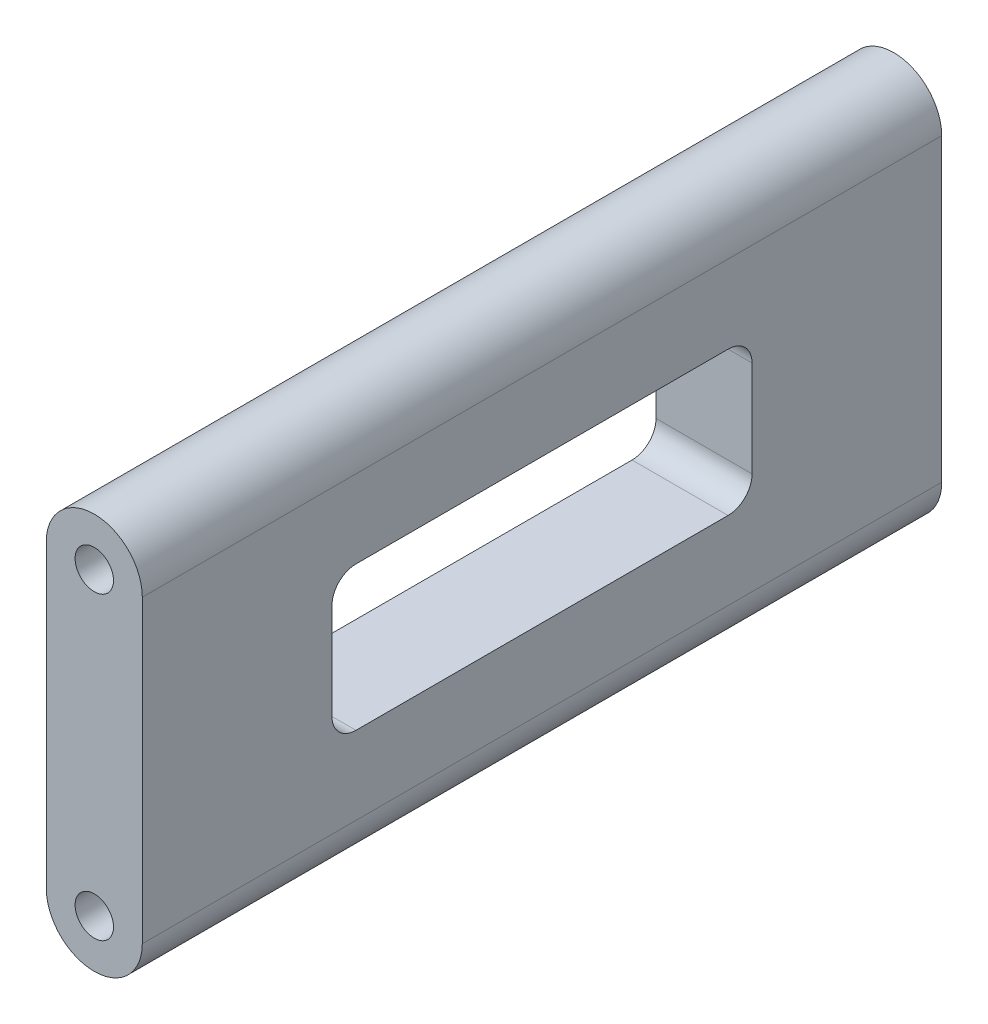
ISO-10303-21;
HEADER;
FILE_DESCRIPTION(('STEP AP214'),'2;1');
FILE_NAME('part.step','',(''),(''),'','','');
FILE_SCHEMA(('AUTOMOTIVE_DESIGN { 1 0 10303 214 1 1 1 1 }'));
ENDSEC;
DATA;
#1=APPLICATION_CONTEXT('core data for automotive mechanical design processes');
#2=APPLICATION_PROTOCOL_DEFINITION('international standard','automotive_design',2000,#1);
#3=PRODUCT_CONTEXT('',#1,'mechanical');
#4=PRODUCT('Part','Part','',(#3));
#5=PRODUCT_RELATED_PRODUCT_CATEGORY('part','',(#4));
#6=PRODUCT_DEFINITION_FORMATION('','',#4);
#7=PRODUCT_DEFINITION_CONTEXT('part definition',#1,'design');
#8=PRODUCT_DEFINITION('design','',#6,#7);
#9=PRODUCT_DEFINITION_SHAPE('','',#8);
#10=(LENGTH_UNIT() NAMED_UNIT(*) SI_UNIT(.MILLI.,.METRE.));
#11=(NAMED_UNIT(*) PLANE_ANGLE_UNIT() SI_UNIT($,.RADIAN.));
#12=(NAMED_UNIT(*) SI_UNIT($,.STERADIAN.) SOLID_ANGLE_UNIT());
#13=UNCERTAINTY_MEASURE_WITH_UNIT(LENGTH_MEASURE(1.E-05),#10,'distance_accuracy_value','');
#14=(GEOMETRIC_REPRESENTATION_CONTEXT(3) GLOBAL_UNCERTAINTY_ASSIGNED_CONTEXT((#13)) GLOBAL_UNIT_ASSIGNED_CONTEXT((#10,
#11,#12)) REPRESENTATION_CONTEXT('',''));
#15=CARTESIAN_POINT('',(0.,0.,0.));
#16=DIRECTION('',(0.,0.,1.));
#17=DIRECTION('',(1.,0.,0.));
#18=AXIS2_PLACEMENT_3D('',#15,#16,#17);
#19=CARTESIAN_POINT('',(0.,-12.5,66.6));
#20=DIRECTION('',(0.,0.,1.));
#21=DIRECTION('',(1.,0.,0.));
#22=AXIS2_PLACEMENT_3D('',#19,#20,#21);
#23=PLANE('',#22);
#24=CARTESIAN_POINT('',(0.,12.5,66.6));
#25=DIRECTION('',(0.,0.,1.));
#26=DIRECTION('',(1.,0.,0.));
#27=AXIS2_PLACEMENT_3D('',#24,#25,#26);
#28=CIRCLE('',#27,1.6);
#29=CARTESIAN_POINT('',(1.6,12.5,66.6));
#30=VERTEX_POINT('',#29);
#31=EDGE_CURVE('E201',#30,#30,#28,.T.);
#32=ORIENTED_EDGE('',*,*,#31,.F.);
#33=EDGE_LOOP('',(#32));
#34=FACE_BOUND('',#33,.T.);
#35=CARTESIAN_POINT('',(0.,-12.5,66.6));
#36=DIRECTION('',(0.,0.,1.));
#37=DIRECTION('',(1.,0.,0.));
#38=AXIS2_PLACEMENT_3D('',#35,#36,#37);
#39=CIRCLE('',#38,4.);
#40=CARTESIAN_POINT('',(-4.,-12.5,66.6));
#41=VERTEX_POINT('',#40);
#42=CARTESIAN_POINT('',(4.,-12.5,66.6));
#43=VERTEX_POINT('',#42);
#44=EDGE_CURVE('E207',#41,#43,#39,.T.);
#45=ORIENTED_EDGE('',*,*,#44,.T.);
#46=DIRECTION('',(0.,1.,0.));
#47=VECTOR('',#46,1.);
#48=CARTESIAN_POINT('',(4.,-12.5,66.6));
#49=LINE('',#48,#47);
#50=CARTESIAN_POINT('',(4.,12.5,66.6));
#51=VERTEX_POINT('',#50);
#52=EDGE_CURVE('E210',#43,#51,#49,.T.);
#53=ORIENTED_EDGE('',*,*,#52,.T.);
#54=CARTESIAN_POINT('',(0.,12.5,66.6));
#55=DIRECTION('',(0.,0.,1.));
#56=DIRECTION('',(1.,0.,0.));
#57=AXIS2_PLACEMENT_3D('',#54,#55,#56);
#58=CIRCLE('',#57,4.);
#59=CARTESIAN_POINT('',(-4.,12.5,66.6));
#60=VERTEX_POINT('',#59);
#61=EDGE_CURVE('E213',#51,#60,#58,.T.);
#62=ORIENTED_EDGE('',*,*,#61,.T.);
#63=DIRECTION('',(0.,-1.,0.));
#64=VECTOR('',#63,1.);
#65=CARTESIAN_POINT('',(-4.,-12.5,66.6));
#66=LINE('',#65,#64);
#67=EDGE_CURVE('E215',#60,#41,#66,.T.);
#68=ORIENTED_EDGE('',*,*,#67,.T.);
#69=EDGE_LOOP('',(#45,#53,#62,#68));
#70=FACE_BOUND('',#69,.T.);
#71=CARTESIAN_POINT('',(0.,-12.5,66.6));
#72=DIRECTION('',(0.,0.,1.));
#73=DIRECTION('',(1.,0.,0.));
#74=AXIS2_PLACEMENT_3D('',#71,#72,#73);
#75=CIRCLE('',#74,1.6);
#76=CARTESIAN_POINT('',(1.6,-12.5,66.6));
#77=VERTEX_POINT('',#76);
#78=EDGE_CURVE('E195',#77,#77,#75,.T.);
#79=ORIENTED_EDGE('',*,*,#78,.F.);
#80=EDGE_LOOP('',(#79));
#81=FACE_BOUND('',#80,.T.);
#82=ADVANCED_FACE('F37',(#34,#70,#81),#23,.T.);
#83=CARTESIAN_POINT('',(0.,-12.5,0.));
#84=DIRECTION('',(0.,0.,1.));
#85=DIRECTION('',(1.,0.,0.));
#86=AXIS2_PLACEMENT_3D('',#83,#84,#85);
#87=PLANE('',#86);
#88=CARTESIAN_POINT('',(0.,-12.5,0.));
#89=DIRECTION('',(0.,0.,1.));
#90=DIRECTION('',(1.,0.,0.));
#91=AXIS2_PLACEMENT_3D('',#88,#89,#90);
#92=CIRCLE('',#91,4.);
#93=CARTESIAN_POINT('',(-4.,-12.5,0.));
#94=VERTEX_POINT('',#93);
#95=CARTESIAN_POINT('',(4.,-12.5,0.));
#96=VERTEX_POINT('',#95);
#97=EDGE_CURVE('E204',#94,#96,#92,.T.);
#98=ORIENTED_EDGE('',*,*,#97,.F.);
#99=DIRECTION('',(0.,-1.,0.));
#100=VECTOR('',#99,1.);
#101=CARTESIAN_POINT('',(-4.,-12.5,0.));
#102=LINE('',#101,#100);
#103=CARTESIAN_POINT('',(-4.,12.5,0.));
#104=VERTEX_POINT('',#103);
#105=EDGE_CURVE('E211',#104,#94,#102,.T.);
#106=ORIENTED_EDGE('',*,*,#105,.F.);
#107=CARTESIAN_POINT('',(0.,12.5,0.));
#108=DIRECTION('',(0.,0.,1.));
#109=DIRECTION('',(1.,0.,0.));
#110=AXIS2_PLACEMENT_3D('',#107,#108,#109);
#111=CIRCLE('',#110,4.);
#112=CARTESIAN_POINT('',(4.,12.5,0.));
#113=VERTEX_POINT('',#112);
#114=EDGE_CURVE('E222',#113,#104,#111,.T.);
#115=ORIENTED_EDGE('',*,*,#114,.F.);
#116=DIRECTION('',(0.,1.,0.));
#117=VECTOR('',#116,1.);
#118=CARTESIAN_POINT('',(4.,-12.5,0.));
#119=LINE('',#118,#117);
#120=EDGE_CURVE('E220',#96,#113,#119,.T.);
#121=ORIENTED_EDGE('',*,*,#120,.F.);
#122=EDGE_LOOP('',(#98,#106,#115,#121));
#123=FACE_BOUND('',#122,.T.);
#124=CARTESIAN_POINT('',(0.,12.5,0.));
#125=DIRECTION('',(0.,0.,1.));
#126=DIRECTION('',(1.,0.,0.));
#127=AXIS2_PLACEMENT_3D('',#124,#125,#126);
#128=CIRCLE('',#127,1.6);
#129=CARTESIAN_POINT('',(1.6,12.5,0.));
#130=VERTEX_POINT('',#129);
#131=EDGE_CURVE('E198',#130,#130,#128,.T.);
#132=ORIENTED_EDGE('',*,*,#131,.T.);
#133=EDGE_LOOP('',(#132));
#134=FACE_BOUND('',#133,.T.);
#135=CARTESIAN_POINT('',(0.,-12.5,0.));
#136=DIRECTION('',(0.,0.,1.));
#137=DIRECTION('',(1.,0.,0.));
#138=AXIS2_PLACEMENT_3D('',#135,#136,#137);
#139=CIRCLE('',#138,1.6);
#140=CARTESIAN_POINT('',(1.6,-12.5,0.));
#141=VERTEX_POINT('',#140);
#142=EDGE_CURVE('E183',#141,#141,#139,.T.);
#143=ORIENTED_EDGE('',*,*,#142,.T.);
#144=EDGE_LOOP('',(#143));
#145=FACE_BOUND('',#144,.T.);
#146=ADVANCED_FACE('F240',(#123,#134,#145),#87,.F.);
#147=CARTESIAN_POINT('',(0.,-12.5,66.6));
#148=DIRECTION('',(0.,0.,-1.));
#149=DIRECTION('',(-1.,0.,0.));
#150=AXIS2_PLACEMENT_3D('',#147,#148,#149);
#151=CYLINDRICAL_SURFACE('',#150,4.);
#152=ORIENTED_EDGE('',*,*,#97,.T.);
#153=DIRECTION('',(0.,0.,-1.));
#154=VECTOR('',#153,1.);
#155=CARTESIAN_POINT('',(4.,-12.5,66.6));
#156=LINE('',#155,#154);
#157=EDGE_CURVE('E11',#43,#96,#156,.T.);
#158=ORIENTED_EDGE('',*,*,#157,.F.);
#159=ORIENTED_EDGE('',*,*,#44,.F.);
#160=DIRECTION('',(0.,0.,-1.));
#161=VECTOR('',#160,1.);
#162=CARTESIAN_POINT('',(-4.,-12.5,66.6));
#163=LINE('',#162,#161);
#164=EDGE_CURVE('E217',#41,#94,#163,.T.);
#165=ORIENTED_EDGE('',*,*,#164,.T.);
#166=EDGE_LOOP('',(#152,#158,#159,#165));
#167=FACE_BOUND('',#166,.T.);
#168=ADVANCED_FACE('F39',(#167),#151,.T.);
#169=CARTESIAN_POINT('',(4.,-12.5,66.6));
#170=DIRECTION('',(-1.,0.,0.));
#171=DIRECTION('',(0.,-1.,0.));
#172=AXIS2_PLACEMENT_3D('',#169,#170,#171);
#173=PLANE('',#172);
#174=DIRECTION('',(0.,0.,-1.));
#175=VECTOR('',#174,1.);
#176=CARTESIAN_POINT('',(4.,-6.,17.8));
#177=LINE('',#176,#175);
#178=CARTESIAN_POINT('',(4.,-6.00000000000001,48.8));
#179=VERTEX_POINT('',#178);
#180=CARTESIAN_POINT('',(4.,-6.,17.8));
#181=VERTEX_POINT('',#180);
#182=EDGE_CURVE('E165',#179,#181,#177,.T.);
#183=ORIENTED_EDGE('',*,*,#182,.F.);
#184=CARTESIAN_POINT('',(4.,-4.00000000000001,48.8));
#185=DIRECTION('',(1.,0.,0.));
#186=DIRECTION('',(0.,-1.,0.));
#187=AXIS2_PLACEMENT_3D('',#184,#185,#186);
#188=CIRCLE('',#187,2.);
#189=CARTESIAN_POINT('',(4.,-3.99999999999999,50.8));
#190=VERTEX_POINT('',#189);
#191=EDGE_CURVE('E52',#190,#179,#188,.T.);
#192=ORIENTED_EDGE('',*,*,#191,.F.);
#193=DIRECTION('',(0.,-1.,0.));
#194=VECTOR('',#193,1.);
#195=CARTESIAN_POINT('',(4.,-3.99999999999999,50.8));
#196=LINE('',#195,#194);
#197=CARTESIAN_POINT('',(4.,3.99999999999998,50.8));
#198=VERTEX_POINT('',#197);
#199=EDGE_CURVE('E145',#198,#190,#196,.T.);
#200=ORIENTED_EDGE('',*,*,#199,.F.);
#201=CARTESIAN_POINT('',(4.,3.99999999999999,48.8));
#202=DIRECTION('',(1.,0.,0.));
#203=DIRECTION('',(0.,1.,0.));
#204=AXIS2_PLACEMENT_3D('',#201,#202,#203);
#205=CIRCLE('',#204,2.);
#206=CARTESIAN_POINT('',(4.,5.99999999999999,48.8));
#207=VERTEX_POINT('',#206);
#208=EDGE_CURVE('E148',#207,#198,#205,.T.);
#209=ORIENTED_EDGE('',*,*,#208,.F.);
#210=DIRECTION('',(0.,0.,1.));
#211=VECTOR('',#210,1.);
#212=CARTESIAN_POINT('',(4.,6.,17.8));
#213=LINE('',#212,#211);
#214=CARTESIAN_POINT('',(4.,6.,17.8));
#215=VERTEX_POINT('',#214);
#216=EDGE_CURVE('E176',#215,#207,#213,.T.);
#217=ORIENTED_EDGE('',*,*,#216,.F.);
#218=CARTESIAN_POINT('',(4.,4.,17.8));
#219=DIRECTION('',(1.,0.,0.));
#220=DIRECTION('',(0.,1.,0.));
#221=AXIS2_PLACEMENT_3D('',#218,#219,#220);
#222=CIRCLE('',#221,2.);
#223=CARTESIAN_POINT('',(4.,3.99999999999999,15.8));
#224=VERTEX_POINT('',#223);
#225=EDGE_CURVE('E173',#224,#215,#222,.T.);
#226=ORIENTED_EDGE('',*,*,#225,.F.);
#227=DIRECTION('',(0.,1.,0.));
#228=VECTOR('',#227,1.);
#229=CARTESIAN_POINT('',(4.,-3.99999999999999,15.8));
#230=LINE('',#229,#228);
#231=CARTESIAN_POINT('',(4.,-3.99999999999999,15.8));
#232=VERTEX_POINT('',#231);
#233=EDGE_CURVE('E170',#232,#224,#230,.T.);
#234=ORIENTED_EDGE('',*,*,#233,.F.);
#235=CARTESIAN_POINT('',(4.,-4.,17.8));
#236=DIRECTION('',(1.,0.,0.));
#237=DIRECTION('',(0.,1.,0.));
#238=AXIS2_PLACEMENT_3D('',#235,#236,#237);
#239=CIRCLE('',#238,2.);
#240=EDGE_CURVE('E167',#181,#232,#239,.T.);
#241=ORIENTED_EDGE('',*,*,#240,.F.);
#242=EDGE_LOOP('',(#183,#192,#200,#209,#217,#226,#234,#241));
#243=FACE_BOUND('',#242,.T.);
#244=ORIENTED_EDGE('',*,*,#120,.T.);
#245=DIRECTION('',(0.,0.,-1.));
#246=VECTOR('',#245,1.);
#247=CARTESIAN_POINT('',(4.,12.5,66.6));
#248=LINE('',#247,#246);
#249=EDGE_CURVE('E45',#51,#113,#248,.T.);
#250=ORIENTED_EDGE('',*,*,#249,.F.);
#251=ORIENTED_EDGE('',*,*,#52,.F.);
#252=ORIENTED_EDGE('',*,*,#157,.T.);
#253=EDGE_LOOP('',(#244,#250,#251,#252));
#254=FACE_BOUND('',#253,.T.);
#255=ADVANCED_FACE('F249',(#243,#254),#173,.F.);
#256=CARTESIAN_POINT('',(0.,12.5,66.6));
#257=DIRECTION('',(0.,0.,-1.));
#258=DIRECTION('',(-1.,0.,0.));
#259=AXIS2_PLACEMENT_3D('',#256,#257,#258);
#260=CYLINDRICAL_SURFACE('',#259,4.);
#261=ORIENTED_EDGE('',*,*,#114,.T.);
#262=DIRECTION('',(0.,0.,-1.));
#263=VECTOR('',#262,1.);
#264=CARTESIAN_POINT('',(-4.,12.5,66.6));
#265=LINE('',#264,#263);
#266=EDGE_CURVE('E227',#60,#104,#265,.T.);
#267=ORIENTED_EDGE('',*,*,#266,.F.);
#268=ORIENTED_EDGE('',*,*,#61,.F.);
#269=ORIENTED_EDGE('',*,*,#249,.T.);
#270=EDGE_LOOP('',(#261,#267,#268,#269));
#271=FACE_BOUND('',#270,.T.);
#272=ADVANCED_FACE('F234',(#271),#260,.T.);
#273=CARTESIAN_POINT('',(-4.,-12.5,66.6));
#274=DIRECTION('',(1.,0.,0.));
#275=DIRECTION('',(0.,1.,0.));
#276=AXIS2_PLACEMENT_3D('',#273,#274,#275);
#277=PLANE('',#276);
#278=DIRECTION('',(0.,-1.,0.));
#279=VECTOR('',#278,1.);
#280=CARTESIAN_POINT('',(-4.00000000000001,-3.99999999999999,50.8));
#281=LINE('',#280,#279);
#282=CARTESIAN_POINT('',(-4.00000000000001,3.99999999999998,50.8));
#283=VERTEX_POINT('',#282);
#284=CARTESIAN_POINT('',(-4.00000000000001,-3.99999999999999,50.8));
#285=VERTEX_POINT('',#284);
#286=EDGE_CURVE('E134',#283,#285,#281,.T.);
#287=ORIENTED_EDGE('',*,*,#286,.T.);
#288=CARTESIAN_POINT('',(-4.00000000000001,-4.00000000000001,48.8));
#289=DIRECTION('',(1.,0.,0.));
#290=DIRECTION('',(0.,-1.,0.));
#291=AXIS2_PLACEMENT_3D('',#288,#289,#290);
#292=CIRCLE('',#291,2.);
#293=CARTESIAN_POINT('',(-4.00000000000001,-6.00000000000001,48.8));
#294=VERTEX_POINT('',#293);
#295=EDGE_CURVE('E128',#285,#294,#292,.T.);
#296=ORIENTED_EDGE('',*,*,#295,.T.);
#297=DIRECTION('',(0.,0.,-1.));
#298=VECTOR('',#297,1.);
#299=CARTESIAN_POINT('',(-4.00000000000001,-6.,17.8));
#300=LINE('',#299,#298);
#301=CARTESIAN_POINT('',(-4.,-6.,17.8));
#302=VERTEX_POINT('',#301);
#303=EDGE_CURVE('E137',#294,#302,#300,.T.);
#304=ORIENTED_EDGE('',*,*,#303,.T.);
#305=CARTESIAN_POINT('',(-4.00000000000001,-4.,17.8));
#306=DIRECTION('',(1.,0.,0.));
#307=DIRECTION('',(0.,1.,0.));
#308=AXIS2_PLACEMENT_3D('',#305,#306,#307);
#309=CIRCLE('',#308,2.);
#310=CARTESIAN_POINT('',(-4.00000000000001,-3.99999999999999,15.8));
#311=VERTEX_POINT('',#310);
#312=EDGE_CURVE('E60',#302,#311,#309,.T.);
#313=ORIENTED_EDGE('',*,*,#312,.T.);
#314=DIRECTION('',(0.,1.,0.));
#315=VECTOR('',#314,1.);
#316=CARTESIAN_POINT('',(-4.00000000000001,-3.99999999999999,15.8));
#317=LINE('',#316,#315);
#318=CARTESIAN_POINT('',(-4.00000000000001,3.99999999999998,15.8));
#319=VERTEX_POINT('',#318);
#320=EDGE_CURVE('E152',#311,#319,#317,.T.);
#321=ORIENTED_EDGE('',*,*,#320,.T.);
#322=CARTESIAN_POINT('',(-4.00000000000001,4.,17.8));
#323=DIRECTION('',(1.,0.,0.));
#324=DIRECTION('',(0.,1.,0.));
#325=AXIS2_PLACEMENT_3D('',#322,#323,#324);
#326=CIRCLE('',#325,2.);
#327=CARTESIAN_POINT('',(-4.00000000000001,6.,17.8));
#328=VERTEX_POINT('',#327);
#329=EDGE_CURVE('E155',#319,#328,#326,.T.);
#330=ORIENTED_EDGE('',*,*,#329,.T.);
#331=DIRECTION('',(0.,0.,1.));
#332=VECTOR('',#331,1.);
#333=CARTESIAN_POINT('',(-4.00000000000001,6.,17.8));
#334=LINE('',#333,#332);
#335=CARTESIAN_POINT('',(-4.00000000000001,5.99999999999999,48.8));
#336=VERTEX_POINT('',#335);
#337=EDGE_CURVE('E158',#328,#336,#334,.T.);
#338=ORIENTED_EDGE('',*,*,#337,.T.);
#339=CARTESIAN_POINT('',(-4.00000000000001,3.99999999999999,48.8));
#340=DIRECTION('',(1.,0.,0.));
#341=DIRECTION('',(0.,1.,0.));
#342=AXIS2_PLACEMENT_3D('',#339,#340,#341);
#343=CIRCLE('',#342,2.);
#344=EDGE_CURVE('E161',#336,#283,#343,.T.);
#345=ORIENTED_EDGE('',*,*,#344,.T.);
#346=EDGE_LOOP('',(#287,#296,#304,#313,#321,#330,#338,#345));
#347=FACE_BOUND('',#346,.T.);
#348=ORIENTED_EDGE('',*,*,#105,.T.);
#349=ORIENTED_EDGE('',*,*,#164,.F.);
#350=ORIENTED_EDGE('',*,*,#67,.F.);
#351=ORIENTED_EDGE('',*,*,#266,.T.);
#352=EDGE_LOOP('',(#348,#349,#350,#351));
#353=FACE_BOUND('',#352,.T.);
#354=ADVANCED_FACE('F141',(#347,#353),#277,.F.);
#355=CARTESIAN_POINT('',(0.,12.5,66.6));
#356=DIRECTION('',(0.,0.,-1.));
#357=DIRECTION('',(-1.,0.,0.));
#358=AXIS2_PLACEMENT_3D('',#355,#356,#357);
#359=CYLINDRICAL_SURFACE('',#358,1.6);
#360=ORIENTED_EDGE('',*,*,#31,.T.);
#361=EDGE_LOOP('',(#360));
#362=FACE_BOUND('',#361,.T.);
#363=ORIENTED_EDGE('',*,*,#131,.F.);
#364=EDGE_LOOP('',(#363));
#365=FACE_BOUND('',#364,.T.);
#366=ADVANCED_FACE('F268',(#362,#365),#359,.F.);
#367=CARTESIAN_POINT('',(0.,-12.5,66.6));
#368=DIRECTION('',(0.,0.,-1.));
#369=DIRECTION('',(-1.,0.,0.));
#370=AXIS2_PLACEMENT_3D('',#367,#368,#369);
#371=CYLINDRICAL_SURFACE('',#370,1.6);
#372=ORIENTED_EDGE('',*,*,#78,.T.);
#373=EDGE_LOOP('',(#372));
#374=FACE_BOUND('',#373,.T.);
#375=ORIENTED_EDGE('',*,*,#142,.F.);
#376=EDGE_LOOP('',(#375));
#377=FACE_BOUND('',#376,.T.);
#378=ADVANCED_FACE('F275',(#374,#377),#371,.F.);
#379=CARTESIAN_POINT('',(-4.00000000000001,-4.00000000000001,48.8));
#380=DIRECTION('',(1.,0.,0.));
#381=DIRECTION('',(0.,1.,0.));
#382=AXIS2_PLACEMENT_3D('',#379,#380,#381);
#383=CYLINDRICAL_SURFACE('',#382,2.);
#384=ORIENTED_EDGE('',*,*,#191,.T.);
#385=DIRECTION('',(1.,0.,0.));
#386=VECTOR('',#385,1.);
#387=CARTESIAN_POINT('',(-4.00000000000001,-6.00000000000001,48.8));
#388=LINE('',#387,#386);
#389=EDGE_CURVE('E124',#294,#179,#388,.T.);
#390=ORIENTED_EDGE('',*,*,#389,.F.);
#391=ORIENTED_EDGE('',*,*,#295,.F.);
#392=DIRECTION('',(1.,0.,0.));
#393=VECTOR('',#392,1.);
#394=CARTESIAN_POINT('',(-4.00000000000001,-3.99999999999999,50.8));
#395=LINE('',#394,#393);
#396=EDGE_CURVE('E181',#285,#190,#395,.T.);
#397=ORIENTED_EDGE('',*,*,#396,.T.);
#398=EDGE_LOOP('',(#384,#390,#391,#397));
#399=FACE_BOUND('',#398,.T.);
#400=ADVANCED_FACE('F126',(#399),#383,.F.);
#401=CARTESIAN_POINT('',(-4.00000000000001,-3.99999999999999,50.8));
#402=DIRECTION('',(0.,0.,1.));
#403=DIRECTION('',(1.,0.,0.));
#404=AXIS2_PLACEMENT_3D('',#401,#402,#403);
#405=PLANE('',#404);
#406=ORIENTED_EDGE('',*,*,#199,.T.);
#407=ORIENTED_EDGE('',*,*,#396,.F.);
#408=ORIENTED_EDGE('',*,*,#286,.F.);
#409=DIRECTION('',(1.,0.,0.));
#410=VECTOR('',#409,1.);
#411=CARTESIAN_POINT('',(-4.00000000000001,3.99999999999998,50.8));
#412=LINE('',#411,#410);
#413=EDGE_CURVE('E184',#283,#198,#412,.T.);
#414=ORIENTED_EDGE('',*,*,#413,.T.);
#415=EDGE_LOOP('',(#406,#407,#408,#414));
#416=FACE_BOUND('',#415,.T.);
#417=ADVANCED_FACE('F287',(#416),#405,.F.);
#418=CARTESIAN_POINT('',(-4.00000000000001,3.99999999999999,48.8));
#419=DIRECTION('',(1.,0.,0.));
#420=DIRECTION('',(0.,1.,0.));
#421=AXIS2_PLACEMENT_3D('',#418,#419,#420);
#422=CYLINDRICAL_SURFACE('',#421,2.);
#423=ORIENTED_EDGE('',*,*,#208,.T.);
#424=ORIENTED_EDGE('',*,*,#413,.F.);
#425=ORIENTED_EDGE('',*,*,#344,.F.);
#426=DIRECTION('',(1.,0.,0.));
#427=VECTOR('',#426,1.);
#428=CARTESIAN_POINT('',(-4.00000000000001,5.99999999999999,48.8));
#429=LINE('',#428,#427);
#430=EDGE_CURVE('E186',#336,#207,#429,.T.);
#431=ORIENTED_EDGE('',*,*,#430,.T.);
#432=EDGE_LOOP('',(#423,#424,#425,#431));
#433=FACE_BOUND('',#432,.T.);
#434=ADVANCED_FACE('F306',(#433),#422,.F.);
#435=CARTESIAN_POINT('',(-4.00000000000001,6.,17.8));
#436=DIRECTION('',(0.,1.,0.));
#437=DIRECTION('',(-1.,0.,0.));
#438=AXIS2_PLACEMENT_3D('',#435,#436,#437);
#439=PLANE('',#438);
#440=ORIENTED_EDGE('',*,*,#216,.T.);
#441=ORIENTED_EDGE('',*,*,#430,.F.);
#442=ORIENTED_EDGE('',*,*,#337,.F.);
#443=DIRECTION('',(1.,0.,0.));
#444=VECTOR('',#443,1.);
#445=CARTESIAN_POINT('',(-4.00000000000001,6.,17.8));
#446=LINE('',#445,#444);
#447=EDGE_CURVE('E188',#328,#215,#446,.T.);
#448=ORIENTED_EDGE('',*,*,#447,.T.);
#449=EDGE_LOOP('',(#440,#441,#442,#448));
#450=FACE_BOUND('',#449,.T.);
#451=ADVANCED_FACE('F302',(#450),#439,.F.);
#452=CARTESIAN_POINT('',(-4.00000000000001,4.,17.8));
#453=DIRECTION('',(1.,0.,0.));
#454=DIRECTION('',(0.,1.,0.));
#455=AXIS2_PLACEMENT_3D('',#452,#453,#454);
#456=CYLINDRICAL_SURFACE('',#455,2.);
#457=ORIENTED_EDGE('',*,*,#225,.T.);
#458=ORIENTED_EDGE('',*,*,#447,.F.);
#459=ORIENTED_EDGE('',*,*,#329,.F.);
#460=DIRECTION('',(1.,0.,0.));
#461=VECTOR('',#460,1.);
#462=CARTESIAN_POINT('',(-4.00000000000001,3.99999999999998,15.8));
#463=LINE('',#462,#461);
#464=EDGE_CURVE('E190',#319,#224,#463,.T.);
#465=ORIENTED_EDGE('',*,*,#464,.T.);
#466=EDGE_LOOP('',(#457,#458,#459,#465));
#467=FACE_BOUND('',#466,.T.);
#468=ADVANCED_FACE('F298',(#467),#456,.F.);
#469=CARTESIAN_POINT('',(-4.00000000000001,-3.99999999999999,15.8));
#470=DIRECTION('',(0.,0.,-1.));
#471=DIRECTION('',(-1.,0.,0.));
#472=AXIS2_PLACEMENT_3D('',#469,#470,#471);
#473=PLANE('',#472);
#474=ORIENTED_EDGE('',*,*,#233,.T.);
#475=ORIENTED_EDGE('',*,*,#464,.F.);
#476=ORIENTED_EDGE('',*,*,#320,.F.);
#477=DIRECTION('',(1.,0.,0.));
#478=VECTOR('',#477,1.);
#479=CARTESIAN_POINT('',(-4.00000000000001,-3.99999999999999,15.8));
#480=LINE('',#479,#478);
#481=EDGE_CURVE('E192',#311,#232,#480,.T.);
#482=ORIENTED_EDGE('',*,*,#481,.T.);
#483=EDGE_LOOP('',(#474,#475,#476,#482));
#484=FACE_BOUND('',#483,.T.);
#485=ADVANCED_FACE('F295',(#484),#473,.F.);
#486=CARTESIAN_POINT('',(-4.00000000000001,-4.,17.8));
#487=DIRECTION('',(1.,0.,0.));
#488=DIRECTION('',(0.,1.,0.));
#489=AXIS2_PLACEMENT_3D('',#486,#487,#488);
#490=CYLINDRICAL_SURFACE('',#489,2.);
#491=ORIENTED_EDGE('',*,*,#240,.T.);
#492=ORIENTED_EDGE('',*,*,#481,.F.);
#493=ORIENTED_EDGE('',*,*,#312,.F.);
#494=DIRECTION('',(1.,0.,0.));
#495=VECTOR('',#494,1.);
#496=CARTESIAN_POINT('',(-4.00000000000001,-6.,17.8));
#497=LINE('',#496,#495);
#498=EDGE_CURVE('E133',#302,#181,#497,.T.);
#499=ORIENTED_EDGE('',*,*,#498,.T.);
#500=EDGE_LOOP('',(#491,#492,#493,#499));
#501=FACE_BOUND('',#500,.T.);
#502=ADVANCED_FACE('F292',(#501),#490,.F.);
#503=CARTESIAN_POINT('',(-4.00000000000001,-6.,17.8));
#504=DIRECTION('',(0.,-1.,0.));
#505=DIRECTION('',(1.,0.,0.));
#506=AXIS2_PLACEMENT_3D('',#503,#504,#505);
#507=PLANE('',#506);
#508=ORIENTED_EDGE('',*,*,#182,.T.);
#509=ORIENTED_EDGE('',*,*,#498,.F.);
#510=ORIENTED_EDGE('',*,*,#303,.F.);
#511=ORIENTED_EDGE('',*,*,#389,.T.);
#512=EDGE_LOOP('',(#508,#509,#510,#511));
#513=FACE_BOUND('',#512,.T.);
#514=ADVANCED_FACE('F138',(#513),#507,.F.);
#515=CLOSED_SHELL('',(#82,#146,#168,#255,#272,#354,#366,#378,#400,#417,#434,#451,#468,#485,#502,#514));
#516=MANIFOLD_SOLID_BREP('B2',#515);
#517=ADVANCED_BREP_SHAPE_REPRESENTATION('',(#18,#516),#14);
#518=SHAPE_DEFINITION_REPRESENTATION(#9,#517);
ENDSEC;
END-ISO-10303-21;
